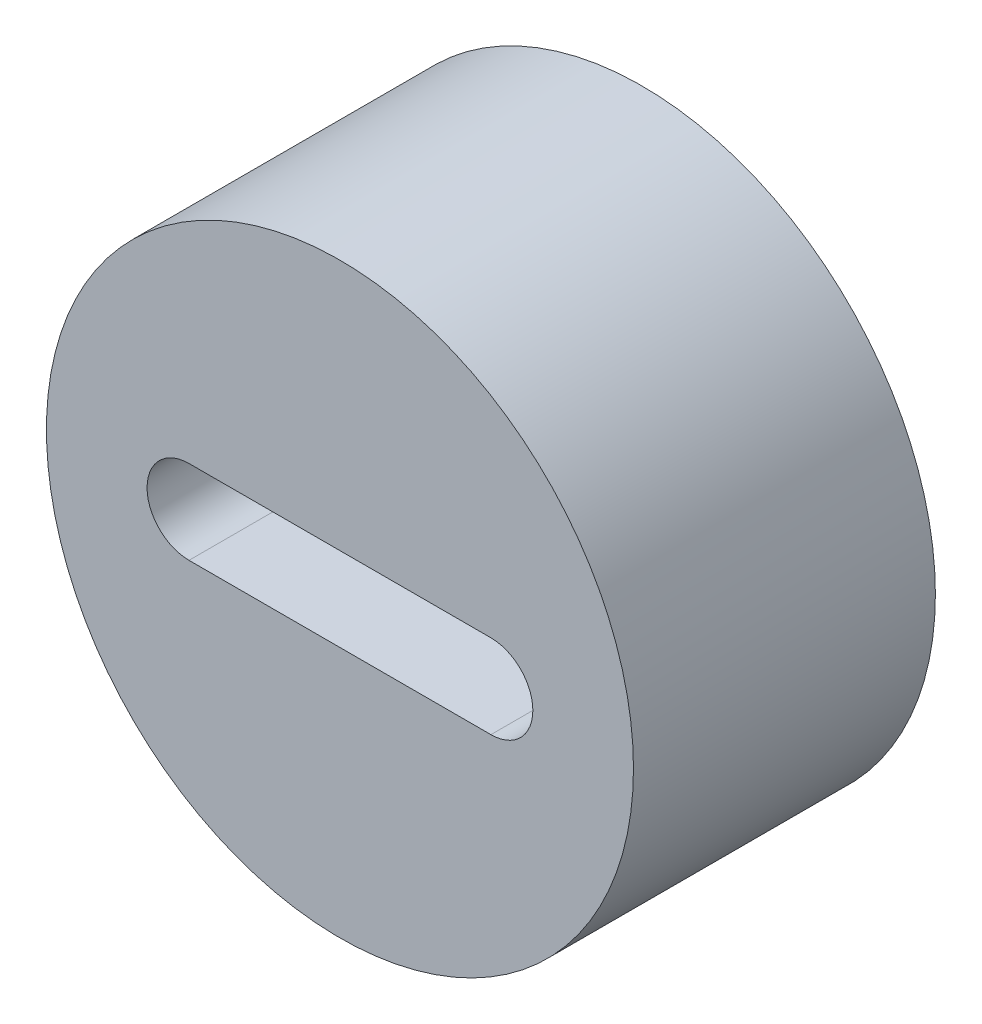
ISO-10303-21;
HEADER;
FILE_DESCRIPTION(('STEP AP214'),'2;1');
FILE_NAME('part.step','',(''),(''),'','','');
FILE_SCHEMA(('AUTOMOTIVE_DESIGN { 1 0 10303 214 1 1 1 1 }'));
ENDSEC;
DATA;
#1=APPLICATION_CONTEXT('core data for automotive mechanical design processes');
#2=APPLICATION_PROTOCOL_DEFINITION('international standard','automotive_design',2000,#1);
#3=PRODUCT_CONTEXT('',#1,'mechanical');
#4=PRODUCT('Part','Part','',(#3));
#5=PRODUCT_RELATED_PRODUCT_CATEGORY('part','',(#4));
#6=PRODUCT_DEFINITION_FORMATION('','',#4);
#7=PRODUCT_DEFINITION_CONTEXT('part definition',#1,'design');
#8=PRODUCT_DEFINITION('design','',#6,#7);
#9=PRODUCT_DEFINITION_SHAPE('','',#8);
#10=(LENGTH_UNIT() NAMED_UNIT(*) SI_UNIT(.MILLI.,.METRE.));
#11=(NAMED_UNIT(*) PLANE_ANGLE_UNIT() SI_UNIT($,.RADIAN.));
#12=(NAMED_UNIT(*) SI_UNIT($,.STERADIAN.) SOLID_ANGLE_UNIT());
#13=UNCERTAINTY_MEASURE_WITH_UNIT(LENGTH_MEASURE(1.E-05),#10,'distance_accuracy_value','');
#14=(GEOMETRIC_REPRESENTATION_CONTEXT(3) GLOBAL_UNCERTAINTY_ASSIGNED_CONTEXT((#13)) GLOBAL_UNIT_ASSIGNED_CONTEXT((#10,
#11,#12)) REPRESENTATION_CONTEXT('',''));
#15=CARTESIAN_POINT('',(0.,0.,0.));
#16=DIRECTION('',(0.,0.,1.));
#17=DIRECTION('',(1.,0.,0.));
#18=AXIS2_PLACEMENT_3D('',#15,#16,#17);
#19=CARTESIAN_POINT('',(0.,0.,18.));
#20=DIRECTION('',(0.,0.,1.));
#21=DIRECTION('',(1.,0.,0.));
#22=AXIS2_PLACEMENT_3D('',#19,#20,#21);
#23=PLANE('',#22);
#24=CARTESIAN_POINT('',(0.,0.,18.));
#25=DIRECTION('',(0.,0.,1.));
#26=DIRECTION('',(1.,0.,0.));
#27=AXIS2_PLACEMENT_3D('',#24,#25,#26);
#28=CIRCLE('',#27,17.5);
#29=CARTESIAN_POINT('',(17.5,0.,18.));
#30=VERTEX_POINT('',#29);
#31=EDGE_CURVE('E11',#30,#30,#28,.T.);
#32=ORIENTED_EDGE('',*,*,#31,.T.);
#33=EDGE_LOOP('',(#32));
#34=FACE_BOUND('',#33,.T.);
#35=DIRECTION('',(1.,0.,0.));
#36=VECTOR('',#35,1.);
#37=CARTESIAN_POINT('',(-9.,-2.5,18.));
#38=LINE('',#37,#36);
#39=CARTESIAN_POINT('',(-9.,-2.5,18.));
#40=VERTEX_POINT('',#39);
#41=CARTESIAN_POINT('',(9.,-2.5,18.));
#42=VERTEX_POINT('',#41);
#43=EDGE_CURVE('E90',#40,#42,#38,.T.);
#44=ORIENTED_EDGE('',*,*,#43,.F.);
#45=CARTESIAN_POINT('',(-9.,0.,18.));
#46=DIRECTION('',(0.,0.,1.));
#47=DIRECTION('',(1.,0.,0.));
#48=AXIS2_PLACEMENT_3D('',#45,#46,#47);
#49=CIRCLE('',#48,2.5);
#50=CARTESIAN_POINT('',(-9.,2.5,18.));
#51=VERTEX_POINT('',#50);
#52=EDGE_CURVE('E81',#51,#40,#49,.T.);
#53=ORIENTED_EDGE('',*,*,#52,.F.);
#54=DIRECTION('',(-1.,0.,0.));
#55=VECTOR('',#54,1.);
#56=CARTESIAN_POINT('',(-9.,2.5,18.));
#57=LINE('',#56,#55);
#58=CARTESIAN_POINT('',(9.,2.5,18.));
#59=VERTEX_POINT('',#58);
#60=EDGE_CURVE('E106',#59,#51,#57,.T.);
#61=ORIENTED_EDGE('',*,*,#60,.F.);
#62=CARTESIAN_POINT('',(9.,0.,18.));
#63=DIRECTION('',(0.,0.,1.));
#64=DIRECTION('',(1.,0.,0.));
#65=AXIS2_PLACEMENT_3D('',#62,#63,#64);
#66=CIRCLE('',#65,2.5);
#67=EDGE_CURVE('E102',#42,#59,#66,.T.);
#68=ORIENTED_EDGE('',*,*,#67,.F.);
#69=EDGE_LOOP('',(#44,#53,#61,#68));
#70=FACE_BOUND('',#69,.T.);
#71=ADVANCED_FACE('F39',(#34,#70),#23,.T.);
#72=CARTESIAN_POINT('',(0.,0.,0.));
#73=DIRECTION('',(0.,0.,1.));
#74=DIRECTION('',(1.,0.,0.));
#75=AXIS2_PLACEMENT_3D('',#72,#73,#74);
#76=PLANE('',#75);
#77=CARTESIAN_POINT('',(0.,0.,0.));
#78=DIRECTION('',(0.,0.,1.));
#79=DIRECTION('',(1.,0.,0.));
#80=AXIS2_PLACEMENT_3D('',#77,#78,#79);
#81=CIRCLE('',#80,17.5);
#82=CARTESIAN_POINT('',(17.5,0.,0.));
#83=VERTEX_POINT('',#82);
#84=EDGE_CURVE('E43',#83,#83,#81,.T.);
#85=ORIENTED_EDGE('',*,*,#84,.F.);
#86=EDGE_LOOP('',(#85));
#87=FACE_BOUND('',#86,.T.);
#88=CARTESIAN_POINT('',(-9.,0.,0.));
#89=DIRECTION('',(0.,0.,1.));
#90=DIRECTION('',(1.,0.,0.));
#91=AXIS2_PLACEMENT_3D('',#88,#89,#90);
#92=CIRCLE('',#91,2.5);
#93=CARTESIAN_POINT('',(-9.,2.5,0.));
#94=VERTEX_POINT('',#93);
#95=CARTESIAN_POINT('',(-9.,-2.5,0.));
#96=VERTEX_POINT('',#95);
#97=EDGE_CURVE('E63',#94,#96,#92,.T.);
#98=ORIENTED_EDGE('',*,*,#97,.T.);
#99=DIRECTION('',(1.,0.,0.));
#100=VECTOR('',#99,1.);
#101=CARTESIAN_POINT('',(-9.,-2.5,0.));
#102=LINE('',#101,#100);
#103=CARTESIAN_POINT('',(9.,-2.5,0.));
#104=VERTEX_POINT('',#103);
#105=EDGE_CURVE('E97',#96,#104,#102,.T.);
#106=ORIENTED_EDGE('',*,*,#105,.T.);
#107=CARTESIAN_POINT('',(9.,0.,0.));
#108=DIRECTION('',(0.,0.,1.));
#109=DIRECTION('',(1.,0.,0.));
#110=AXIS2_PLACEMENT_3D('',#107,#108,#109);
#111=CIRCLE('',#110,2.5);
#112=CARTESIAN_POINT('',(9.,2.5,0.));
#113=VERTEX_POINT('',#112);
#114=EDGE_CURVE('E115',#104,#113,#111,.T.);
#115=ORIENTED_EDGE('',*,*,#114,.T.);
#116=DIRECTION('',(-1.,0.,0.));
#117=VECTOR('',#116,1.);
#118=CARTESIAN_POINT('',(-9.,2.5,0.));
#119=LINE('',#118,#117);
#120=EDGE_CURVE('E91',#113,#94,#119,.T.);
#121=ORIENTED_EDGE('',*,*,#120,.T.);
#122=EDGE_LOOP('',(#98,#106,#115,#121));
#123=FACE_BOUND('',#122,.T.);
#124=ADVANCED_FACE('F131',(#87,#123),#76,.F.);
#125=CARTESIAN_POINT('',(0.,0.,18.));
#126=DIRECTION('',(0.,0.,-1.));
#127=DIRECTION('',(-1.,0.,0.));
#128=AXIS2_PLACEMENT_3D('',#125,#126,#127);
#129=CYLINDRICAL_SURFACE('',#128,17.5);
#130=ORIENTED_EDGE('',*,*,#31,.F.);
#131=EDGE_LOOP('',(#130));
#132=FACE_BOUND('',#131,.T.);
#133=ORIENTED_EDGE('',*,*,#84,.T.);
#134=EDGE_LOOP('',(#133));
#135=FACE_BOUND('',#134,.T.);
#136=ADVANCED_FACE('F41',(#132,#135),#129,.T.);
#137=CARTESIAN_POINT('',(-9.,0.,18.));
#138=DIRECTION('',(0.,0.,-1.));
#139=DIRECTION('',(-1.,0.,0.));
#140=AXIS2_PLACEMENT_3D('',#137,#138,#139);
#141=CYLINDRICAL_SURFACE('',#140,2.5);
#142=ORIENTED_EDGE('',*,*,#97,.F.);
#143=DIRECTION('',(0.,0.,-1.));
#144=VECTOR('',#143,1.);
#145=CARTESIAN_POINT('',(-9.,2.5,18.));
#146=LINE('',#145,#144);
#147=EDGE_CURVE('E85',#51,#94,#146,.T.);
#148=ORIENTED_EDGE('',*,*,#147,.F.);
#149=ORIENTED_EDGE('',*,*,#52,.T.);
#150=DIRECTION('',(0.,0.,-1.));
#151=VECTOR('',#150,1.);
#152=CARTESIAN_POINT('',(-9.,-2.5,18.));
#153=LINE('',#152,#151);
#154=EDGE_CURVE('E84',#40,#96,#153,.T.);
#155=ORIENTED_EDGE('',*,*,#154,.T.);
#156=EDGE_LOOP('',(#142,#148,#149,#155));
#157=FACE_BOUND('',#156,.T.);
#158=ADVANCED_FACE('F83',(#157),#141,.F.);
#159=CARTESIAN_POINT('',(-9.,-2.5,18.));
#160=DIRECTION('',(0.,1.,0.));
#161=DIRECTION('',(-1.,0.,0.));
#162=AXIS2_PLACEMENT_3D('',#159,#160,#161);
#163=PLANE('',#162);
#164=ORIENTED_EDGE('',*,*,#105,.F.);
#165=ORIENTED_EDGE('',*,*,#154,.F.);
#166=ORIENTED_EDGE('',*,*,#43,.T.);
#167=DIRECTION('',(0.,0.,-1.));
#168=VECTOR('',#167,1.);
#169=CARTESIAN_POINT('',(9.,-2.5,18.));
#170=LINE('',#169,#168);
#171=EDGE_CURVE('E99',#42,#104,#170,.T.);
#172=ORIENTED_EDGE('',*,*,#171,.T.);
#173=EDGE_LOOP('',(#164,#165,#166,#172));
#174=FACE_BOUND('',#173,.T.);
#175=ADVANCED_FACE('F94',(#174),#163,.T.);
#176=CARTESIAN_POINT('',(9.,0.,18.));
#177=DIRECTION('',(0.,0.,-1.));
#178=DIRECTION('',(-1.,0.,0.));
#179=AXIS2_PLACEMENT_3D('',#176,#177,#178);
#180=CYLINDRICAL_SURFACE('',#179,2.5);
#181=ORIENTED_EDGE('',*,*,#114,.F.);
#182=ORIENTED_EDGE('',*,*,#171,.F.);
#183=ORIENTED_EDGE('',*,*,#67,.T.);
#184=DIRECTION('',(0.,0.,-1.));
#185=VECTOR('',#184,1.);
#186=CARTESIAN_POINT('',(9.,2.5,18.));
#187=LINE('',#186,#185);
#188=EDGE_CURVE('E55',#59,#113,#187,.T.);
#189=ORIENTED_EDGE('',*,*,#188,.T.);
#190=EDGE_LOOP('',(#181,#182,#183,#189));
#191=FACE_BOUND('',#190,.T.);
#192=ADVANCED_FACE('F129',(#191),#180,.F.);
#193=CARTESIAN_POINT('',(-9.,2.5,18.));
#194=DIRECTION('',(0.,-1.,0.));
#195=DIRECTION('',(1.,0.,0.));
#196=AXIS2_PLACEMENT_3D('',#193,#194,#195);
#197=PLANE('',#196);
#198=ORIENTED_EDGE('',*,*,#120,.F.);
#199=ORIENTED_EDGE('',*,*,#188,.F.);
#200=ORIENTED_EDGE('',*,*,#60,.T.);
#201=ORIENTED_EDGE('',*,*,#147,.T.);
#202=EDGE_LOOP('',(#198,#199,#200,#201));
#203=FACE_BOUND('',#202,.T.);
#204=ADVANCED_FACE('F132',(#203),#197,.T.);
#205=CLOSED_SHELL('',(#71,#124,#136,#158,#175,#192,#204));
#206=MANIFOLD_SOLID_BREP('B2',#205);
#207=ADVANCED_BREP_SHAPE_REPRESENTATION('',(#18,#206),#14);
#208=SHAPE_DEFINITION_REPRESENTATION(#9,#207);
ENDSEC;
END-ISO-10303-21;
